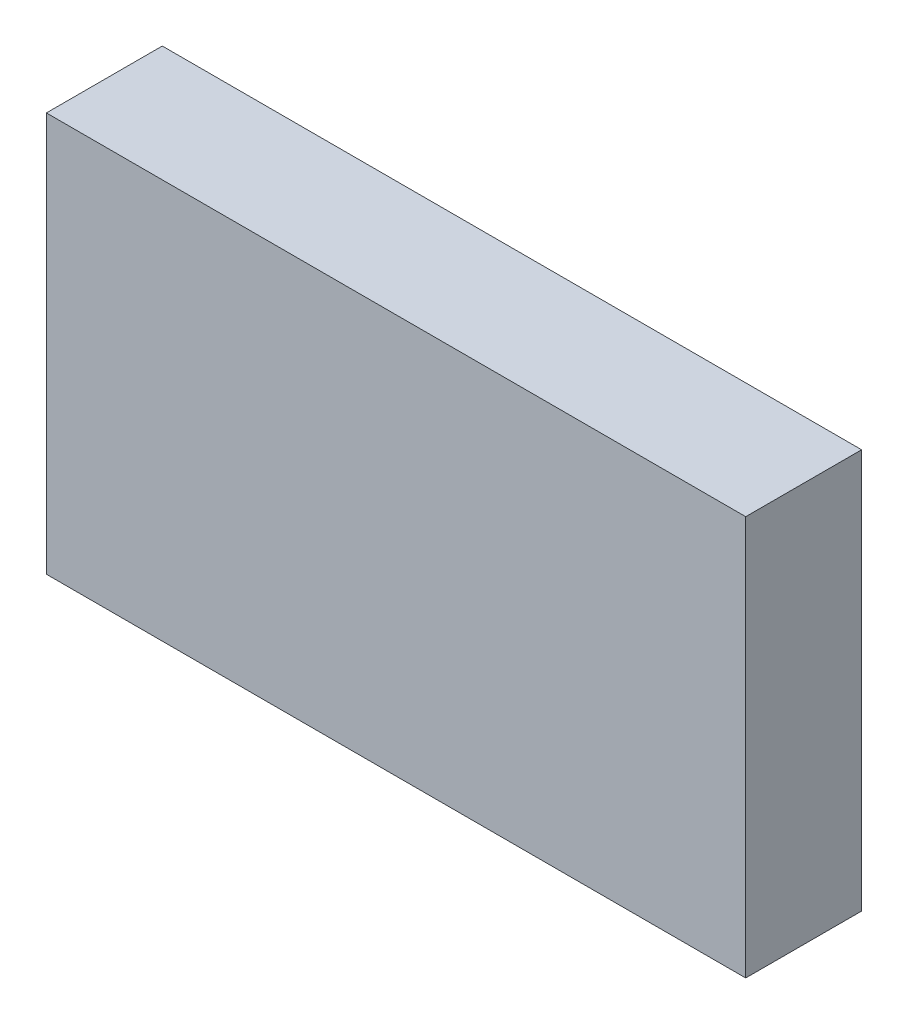
ISO-10303-21;
HEADER;
FILE_DESCRIPTION(('STEP AP214'),'2;1');
FILE_NAME('part.step','',(''),(''),'','','');
FILE_SCHEMA(('AUTOMOTIVE_DESIGN { 1 0 10303 214 1 1 1 1 }'));
ENDSEC;
DATA;
#1=APPLICATION_CONTEXT('core data for automotive mechanical design processes');
#2=APPLICATION_PROTOCOL_DEFINITION('international standard','automotive_design',2000,#1);
#3=PRODUCT_CONTEXT('',#1,'mechanical');
#4=PRODUCT('Part','Part','',(#3));
#5=PRODUCT_RELATED_PRODUCT_CATEGORY('part','',(#4));
#6=PRODUCT_DEFINITION_FORMATION('','',#4);
#7=PRODUCT_DEFINITION_CONTEXT('part definition',#1,'design');
#8=PRODUCT_DEFINITION('design','',#6,#7);
#9=PRODUCT_DEFINITION_SHAPE('','',#8);
#10=(LENGTH_UNIT() NAMED_UNIT(*) SI_UNIT(.MILLI.,.METRE.));
#11=(NAMED_UNIT(*) PLANE_ANGLE_UNIT() SI_UNIT($,.RADIAN.));
#12=(NAMED_UNIT(*) SI_UNIT($,.STERADIAN.) SOLID_ANGLE_UNIT());
#13=UNCERTAINTY_MEASURE_WITH_UNIT(LENGTH_MEASURE(1.E-05),#10,'distance_accuracy_value','');
#14=(GEOMETRIC_REPRESENTATION_CONTEXT(3) GLOBAL_UNCERTAINTY_ASSIGNED_CONTEXT((#13)) GLOBAL_UNIT_ASSIGNED_CONTEXT((#10,
#11,#12)) REPRESENTATION_CONTEXT('',''));
#15=CARTESIAN_POINT('',(0.,0.,0.));
#16=DIRECTION('',(0.,0.,1.));
#17=DIRECTION('',(1.,0.,0.));
#18=AXIS2_PLACEMENT_3D('',#15,#16,#17);
#19=CARTESIAN_POINT('',(2.1118576,-1.2065,0.));
#20=DIRECTION('',(-1.,0.,0.));
#21=DIRECTION('',(0.,0.,1.));
#22=AXIS2_PLACEMENT_3D('',#19,#20,#21);
#23=PLANE('',#22);
#24=DIRECTION('',(0.,1.,0.));
#25=VECTOR('',#24,1.);
#26=CARTESIAN_POINT('',(2.1118576,-1.2065,0.));
#27=LINE('',#26,#25);
#28=CARTESIAN_POINT('',(2.1118576,-1.2065,0.));
#29=VERTEX_POINT('',#28);
#30=CARTESIAN_POINT('',(2.1118576,1.2065,0.));
#31=VERTEX_POINT('',#30);
#32=EDGE_CURVE('E11',#29,#31,#27,.T.);
#33=ORIENTED_EDGE('',*,*,#32,.T.);
#34=DIRECTION('',(0.,0.,1.));
#35=VECTOR('',#34,1.);
#36=CARTESIAN_POINT('',(2.1118576,1.2065,0.));
#37=LINE('',#36,#35);
#38=CARTESIAN_POINT('',(2.1118576,1.2065,0.6999986));
#39=VERTEX_POINT('',#38);
#40=EDGE_CURVE('E28',#31,#39,#37,.T.);
#41=ORIENTED_EDGE('',*,*,#40,.T.);
#42=DIRECTION('',(0.,1.,0.));
#43=VECTOR('',#42,1.);
#44=CARTESIAN_POINT('',(2.1118576,-1.2065,0.6999986));
#45=LINE('',#44,#43);
#46=CARTESIAN_POINT('',(2.1118576,-1.2065,0.6999986));
#47=VERTEX_POINT('',#46);
#48=EDGE_CURVE('E64',#47,#39,#45,.T.);
#49=ORIENTED_EDGE('',*,*,#48,.F.);
#50=DIRECTION('',(0.,0.,1.));
#51=VECTOR('',#50,1.);
#52=CARTESIAN_POINT('',(2.1118576,-1.2065,0.));
#53=LINE('',#52,#51);
#54=EDGE_CURVE('E66',#29,#47,#53,.T.);
#55=ORIENTED_EDGE('',*,*,#54,.F.);
#56=EDGE_LOOP('',(#33,#41,#49,#55));
#57=FACE_BOUND('',#56,.T.);
#58=ADVANCED_FACE('F17',(#57),#23,.F.);
#59=CARTESIAN_POINT('',(2.1118576,1.2065,0.));
#60=DIRECTION('',(0.,-1.,0.));
#61=DIRECTION('',(0.,0.,-1.));
#62=AXIS2_PLACEMENT_3D('',#59,#60,#61);
#63=PLANE('',#62);
#64=DIRECTION('',(-1.,0.,0.));
#65=VECTOR('',#64,1.);
#66=CARTESIAN_POINT('',(2.1118576,1.2065,0.));
#67=LINE('',#66,#65);
#68=CARTESIAN_POINT('',(-2.11185506,1.2065,0.));
#69=VERTEX_POINT('',#68);
#70=EDGE_CURVE('E92',#31,#69,#67,.T.);
#71=ORIENTED_EDGE('',*,*,#70,.T.);
#72=DIRECTION('',(0.,0.,1.));
#73=VECTOR('',#72,1.);
#74=CARTESIAN_POINT('',(-2.11185506,1.2065,0.));
#75=LINE('',#74,#73);
#76=CARTESIAN_POINT('',(-2.11185506,1.2065,0.6999986));
#77=VERTEX_POINT('',#76);
#78=EDGE_CURVE('E94',#69,#77,#75,.T.);
#79=ORIENTED_EDGE('',*,*,#78,.T.);
#80=DIRECTION('',(-1.,0.,0.));
#81=VECTOR('',#80,1.);
#82=CARTESIAN_POINT('',(2.1118576,1.2065,0.6999986));
#83=LINE('',#82,#81);
#84=EDGE_CURVE('E72',#39,#77,#83,.T.);
#85=ORIENTED_EDGE('',*,*,#84,.F.);
#86=ORIENTED_EDGE('',*,*,#40,.F.);
#87=EDGE_LOOP('',(#71,#79,#85,#86));
#88=FACE_BOUND('',#87,.T.);
#89=ADVANCED_FACE('F110',(#88),#63,.F.);
#90=CARTESIAN_POINT('',(-2.11185506,1.2065,0.));
#91=DIRECTION('',(1.,0.,0.));
#92=DIRECTION('',(0.,1.,0.));
#93=AXIS2_PLACEMENT_3D('',#90,#91,#92);
#94=PLANE('',#93);
#95=DIRECTION('',(0.,-1.,0.));
#96=VECTOR('',#95,1.);
#97=CARTESIAN_POINT('',(-2.11185506,1.2065,0.));
#98=LINE('',#97,#96);
#99=CARTESIAN_POINT('',(-2.11185506,-1.2065,0.));
#100=VERTEX_POINT('',#99);
#101=EDGE_CURVE('E102',#69,#100,#98,.T.);
#102=ORIENTED_EDGE('',*,*,#101,.T.);
#103=DIRECTION('',(0.,0.,1.));
#104=VECTOR('',#103,1.);
#105=CARTESIAN_POINT('',(-2.11185506,-1.2065,0.));
#106=LINE('',#105,#104);
#107=CARTESIAN_POINT('',(-2.11185506,-1.2065,0.6999986));
#108=VERTEX_POINT('',#107);
#109=EDGE_CURVE('E97',#100,#108,#106,.T.);
#110=ORIENTED_EDGE('',*,*,#109,.T.);
#111=DIRECTION('',(0.,-1.,0.));
#112=VECTOR('',#111,1.);
#113=CARTESIAN_POINT('',(-2.11185506,1.2065,0.6999986));
#114=LINE('',#113,#112);
#115=EDGE_CURVE('E21',#77,#108,#114,.T.);
#116=ORIENTED_EDGE('',*,*,#115,.F.);
#117=ORIENTED_EDGE('',*,*,#78,.F.);
#118=EDGE_LOOP('',(#102,#110,#116,#117));
#119=FACE_BOUND('',#118,.T.);
#120=ADVANCED_FACE('F114',(#119),#94,.F.);
#121=CARTESIAN_POINT('',(-2.11185506,-1.2065,0.));
#122=DIRECTION('',(0.,1.,0.));
#123=DIRECTION('',(1.,0.,0.));
#124=AXIS2_PLACEMENT_3D('',#121,#122,#123);
#125=PLANE('',#124);
#126=DIRECTION('',(1.,0.,0.));
#127=VECTOR('',#126,1.);
#128=CARTESIAN_POINT('',(-2.11185506,-1.2065,0.));
#129=LINE('',#128,#127);
#130=EDGE_CURVE('E80',#100,#29,#129,.T.);
#131=ORIENTED_EDGE('',*,*,#130,.T.);
#132=ORIENTED_EDGE('',*,*,#54,.T.);
#133=DIRECTION('',(1.,0.,0.));
#134=VECTOR('',#133,1.);
#135=CARTESIAN_POINT('',(-2.11185506,-1.2065,0.6999986));
#136=LINE('',#135,#134);
#137=EDGE_CURVE('E78',#108,#47,#136,.T.);
#138=ORIENTED_EDGE('',*,*,#137,.F.);
#139=ORIENTED_EDGE('',*,*,#109,.F.);
#140=EDGE_LOOP('',(#131,#132,#138,#139));
#141=FACE_BOUND('',#140,.T.);
#142=ADVANCED_FACE('F77',(#141),#125,.F.);
#143=CARTESIAN_POINT('',(2.1118576,-1.2065,0.));
#144=DIRECTION('',(0.,0.,-1.));
#145=DIRECTION('',(0.,-1.,0.));
#146=AXIS2_PLACEMENT_3D('',#143,#144,#145);
#147=PLANE('',#146);
#148=ORIENTED_EDGE('',*,*,#130,.F.);
#149=ORIENTED_EDGE('',*,*,#101,.F.);
#150=ORIENTED_EDGE('',*,*,#70,.F.);
#151=ORIENTED_EDGE('',*,*,#32,.F.);
#152=EDGE_LOOP('',(#148,#149,#150,#151));
#153=FACE_BOUND('',#152,.T.);
#154=ADVANCED_FACE('F167',(#153),#147,.T.);
#155=CARTESIAN_POINT('',(2.1118576,-1.2065,0.6999986));
#156=DIRECTION('',(0.,0.,-1.));
#157=DIRECTION('',(0.,-1.,0.));
#158=AXIS2_PLACEMENT_3D('',#155,#156,#157);
#159=PLANE('',#158);
#160=ORIENTED_EDGE('',*,*,#48,.T.);
#161=ORIENTED_EDGE('',*,*,#84,.T.);
#162=ORIENTED_EDGE('',*,*,#115,.T.);
#163=ORIENTED_EDGE('',*,*,#137,.T.);
#164=EDGE_LOOP('',(#160,#161,#162,#163));
#165=FACE_BOUND('',#164,.T.);
#166=ADVANCED_FACE('F19',(#165),#159,.F.);
#167=CLOSED_SHELL('',(#58,#89,#120,#142,#154,#166));
#168=MANIFOLD_SOLID_BREP('B1',#167);
#169=ADVANCED_BREP_SHAPE_REPRESENTATION('',(#18,#168),#14);
#170=SHAPE_DEFINITION_REPRESENTATION(#9,#169);
ENDSEC;
END-ISO-10303-21;
